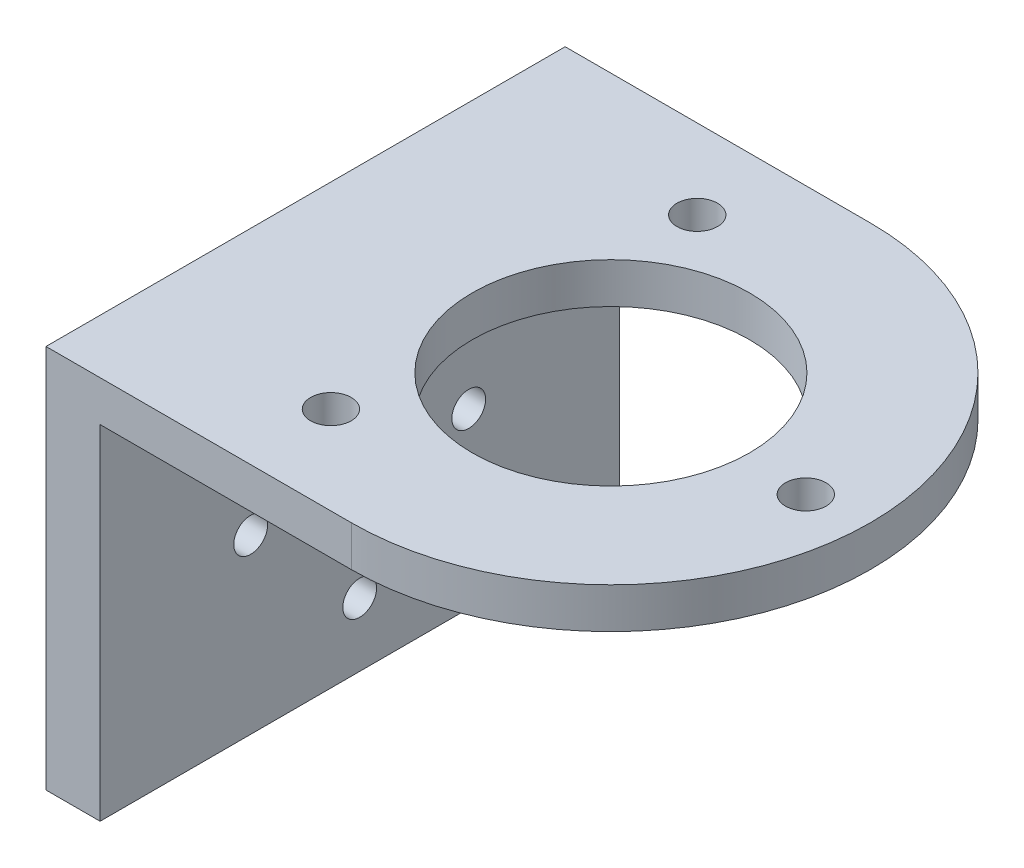
ISO-10303-21;
HEADER;
FILE_DESCRIPTION(('STEP AP214'),'2;1');
FILE_NAME('part.step','',(''),(''),'','','');
FILE_SCHEMA(('AUTOMOTIVE_DESIGN { 1 0 10303 214 1 1 1 1 }'));
ENDSEC;
DATA;
#1=APPLICATION_CONTEXT('core data for automotive mechanical design processes');
#2=APPLICATION_PROTOCOL_DEFINITION('international standard','automotive_design',2000,#1);
#3=PRODUCT_CONTEXT('',#1,'mechanical');
#4=PRODUCT('Part','Part','',(#3));
#5=PRODUCT_RELATED_PRODUCT_CATEGORY('part','',(#4));
#6=PRODUCT_DEFINITION_FORMATION('','',#4);
#7=PRODUCT_DEFINITION_CONTEXT('part definition',#1,'design');
#8=PRODUCT_DEFINITION('design','',#6,#7);
#9=PRODUCT_DEFINITION_SHAPE('','',#8);
#10=(LENGTH_UNIT() NAMED_UNIT(*) SI_UNIT(.MILLI.,.METRE.));
#11=(NAMED_UNIT(*) PLANE_ANGLE_UNIT() SI_UNIT($,.RADIAN.));
#12=(NAMED_UNIT(*) SI_UNIT($,.STERADIAN.) SOLID_ANGLE_UNIT());
#13=UNCERTAINTY_MEASURE_WITH_UNIT(LENGTH_MEASURE(1.E-05),#10,'distance_accuracy_value','');
#14=(GEOMETRIC_REPRESENTATION_CONTEXT(3) GLOBAL_UNCERTAINTY_ASSIGNED_CONTEXT((#13)) GLOBAL_UNIT_ASSIGNED_CONTEXT((#10,
#11,#12)) REPRESENTATION_CONTEXT('',''));
#15=CARTESIAN_POINT('',(0.,0.,0.));
#16=DIRECTION('',(0.,0.,1.));
#17=DIRECTION('',(1.,0.,0.));
#18=AXIS2_PLACEMENT_3D('',#15,#16,#17);
#19=CARTESIAN_POINT('',(0.,0.,0.));
#20=DIRECTION('',(0.,1.,0.));
#21=DIRECTION('',(0.,0.,1.));
#22=AXIS2_PLACEMENT_3D('',#19,#20,#21);
#23=PLANE('',#22);
#24=CARTESIAN_POINT('',(0.,0.,0.));
#25=DIRECTION('',(0.,1.,0.));
#26=DIRECTION('',(0.,0.,1.));
#27=AXIS2_PLACEMENT_3D('',#24,#25,#26);
#28=CIRCLE('',#27,10.25);
#29=CARTESIAN_POINT('',(0.,0.,10.25));
#30=VERTEX_POINT('',#29);
#31=EDGE_CURVE('E147',#30,#30,#28,.T.);
#32=ORIENTED_EDGE('',*,*,#31,.T.);
#33=EDGE_LOOP('',(#32));
#34=FACE_BOUND('',#33,.T.);
#35=CARTESIAN_POINT('',(14.988772763614,0.,0.580250842948611));
#36=DIRECTION('',(0.,1.,0.));
#37=DIRECTION('',(0.,0.,1.));
#38=AXIS2_PLACEMENT_3D('',#35,#36,#37);
#39=CIRCLE('',#38,1.49999999999998);
#40=CARTESIAN_POINT('',(14.988772763614,0.,2.08025084294859));
#41=VERTEX_POINT('',#40);
#42=EDGE_CURVE('E158',#41,#41,#39,.T.);
#43=ORIENTED_EDGE('',*,*,#42,.T.);
#44=EDGE_LOOP('',(#43));
#45=FACE_BOUND('',#44,.T.);
#46=CARTESIAN_POINT('',(-6.92362620941924,0.,-13.306517204447));
#47=DIRECTION('',(0.,1.,0.));
#48=DIRECTION('',(0.,0.,1.));
#49=AXIS2_PLACEMENT_3D('',#46,#47,#48);
#50=CIRCLE('',#49,1.5);
#51=CARTESIAN_POINT('',(-6.92362620941924,0.,-11.806517204447));
#52=VERTEX_POINT('',#51);
#53=EDGE_CURVE('E172',#52,#52,#50,.T.);
#54=ORIENTED_EDGE('',*,*,#53,.T.);
#55=EDGE_LOOP('',(#54));
#56=FACE_BOUND('',#55,.T.);
#57=CARTESIAN_POINT('',(-8.02946006501692,0.,12.6699554483944));
#58=DIRECTION('',(0.,1.,0.));
#59=DIRECTION('',(0.,0.,1.));
#60=AXIS2_PLACEMENT_3D('',#57,#58,#59);
#61=CIRCLE('',#60,1.5);
#62=CARTESIAN_POINT('',(-8.02946006501692,0.,14.1699554483944));
#63=VERTEX_POINT('',#62);
#64=EDGE_CURVE('E151',#63,#63,#61,.T.);
#65=ORIENTED_EDGE('',*,*,#64,.T.);
#66=EDGE_LOOP('',(#65));
#67=FACE_BOUND('',#66,.T.);
#68=DIRECTION('',(0.,0.,1.));
#69=VECTOR('',#68,1.);
#70=CARTESIAN_POINT('',(-18.5713262583329,0.,19.19));
#71=LINE('',#70,#69);
#72=CARTESIAN_POINT('',(-18.5713262583329,0.,-19.19));
#73=VERTEX_POINT('',#72);
#74=CARTESIAN_POINT('',(-18.5713262583329,0.,19.19));
#75=VERTEX_POINT('',#74);
#76=EDGE_CURVE('E69',#73,#75,#71,.T.);
#77=ORIENTED_EDGE('',*,*,#76,.F.);
#78=DIRECTION('',(-1.,0.,0.));
#79=VECTOR('',#78,1.);
#80=CARTESIAN_POINT('',(0.,0.,-19.19));
#81=LINE('',#80,#79);
#82=CARTESIAN_POINT('',(0.,0.,-19.19));
#83=VERTEX_POINT('',#82);
#84=EDGE_CURVE('E177',#83,#73,#81,.T.);
#85=ORIENTED_EDGE('',*,*,#84,.F.);
#86=CARTESIAN_POINT('',(0.,0.,0.));
#87=DIRECTION('',(0.,1.,0.));
#88=DIRECTION('',(0.,0.,1.));
#89=AXIS2_PLACEMENT_3D('',#86,#87,#88);
#90=CIRCLE('',#89,19.19);
#91=CARTESIAN_POINT('',(0.,0.,19.19));
#92=VERTEX_POINT('',#91);
#93=EDGE_CURVE('E175',#92,#83,#90,.T.);
#94=ORIENTED_EDGE('',*,*,#93,.F.);
#95=DIRECTION('',(-1.,0.,0.));
#96=VECTOR('',#95,1.);
#97=CARTESIAN_POINT('',(0.,0.,19.19));
#98=LINE('',#97,#96);
#99=EDGE_CURVE('E179',#92,#75,#98,.T.);
#100=ORIENTED_EDGE('',*,*,#99,.T.);
#101=EDGE_LOOP('',(#77,#85,#94,#100));
#102=FACE_BOUND('',#101,.T.);
#103=ADVANCED_FACE('F54',(#34,#45,#56,#67,#102),#23,.F.);
#104=CARTESIAN_POINT('',(0.,3.,0.));
#105=DIRECTION('',(0.,1.,0.));
#106=DIRECTION('',(0.,0.,1.));
#107=AXIS2_PLACEMENT_3D('',#104,#105,#106);
#108=PLANE('',#107);
#109=CARTESIAN_POINT('',(14.988772763614,3.,0.580250842948611));
#110=DIRECTION('',(0.,1.,0.));
#111=DIRECTION('',(0.,0.,1.));
#112=AXIS2_PLACEMENT_3D('',#109,#110,#111);
#113=CIRCLE('',#112,1.49999999999998);
#114=CARTESIAN_POINT('',(14.988772763614,3.,2.08025084294859));
#115=VERTEX_POINT('',#114);
#116=EDGE_CURVE('E167',#115,#115,#113,.T.);
#117=ORIENTED_EDGE('',*,*,#116,.F.);
#118=EDGE_LOOP('',(#117));
#119=FACE_BOUND('',#118,.T.);
#120=CARTESIAN_POINT('',(0.,3.,0.));
#121=DIRECTION('',(0.,1.,0.));
#122=DIRECTION('',(0.,0.,1.));
#123=AXIS2_PLACEMENT_3D('',#120,#121,#122);
#124=CIRCLE('',#123,19.19);
#125=CARTESIAN_POINT('',(0.,3.,19.19));
#126=VERTEX_POINT('',#125);
#127=CARTESIAN_POINT('',(0.,3.,-19.19));
#128=VERTEX_POINT('',#127);
#129=EDGE_CURVE('E161',#126,#128,#124,.T.);
#130=ORIENTED_EDGE('',*,*,#129,.T.);
#131=DIRECTION('',(-1.,0.,0.));
#132=VECTOR('',#131,1.);
#133=CARTESIAN_POINT('',(0.,3.,-19.19));
#134=LINE('',#133,#132);
#135=CARTESIAN_POINT('',(-22.5713262583329,3.,-19.19));
#136=VERTEX_POINT('',#135);
#137=EDGE_CURVE('E97',#128,#136,#134,.T.);
#138=ORIENTED_EDGE('',*,*,#137,.T.);
#139=DIRECTION('',(0.,0.,1.));
#140=VECTOR('',#139,1.);
#141=CARTESIAN_POINT('',(-22.5713262583329,3.,0.));
#142=LINE('',#141,#140);
#143=CARTESIAN_POINT('',(-22.5713262583329,3.,19.19));
#144=VERTEX_POINT('',#143);
#145=EDGE_CURVE('E120',#136,#144,#142,.T.);
#146=ORIENTED_EDGE('',*,*,#145,.T.);
#147=DIRECTION('',(-1.,0.,0.));
#148=VECTOR('',#147,1.);
#149=CARTESIAN_POINT('',(0.,3.,19.19));
#150=LINE('',#149,#148);
#151=EDGE_CURVE('E165',#126,#144,#150,.T.);
#152=ORIENTED_EDGE('',*,*,#151,.F.);
#153=EDGE_LOOP('',(#130,#138,#146,#152));
#154=FACE_BOUND('',#153,.T.);
#155=CARTESIAN_POINT('',(-6.92362620941924,3.,-13.306517204447));
#156=DIRECTION('',(0.,1.,0.));
#157=DIRECTION('',(0.,0.,1.));
#158=AXIS2_PLACEMENT_3D('',#155,#156,#157);
#159=CIRCLE('',#158,1.5);
#160=CARTESIAN_POINT('',(-6.92362620941924,3.,-11.806517204447));
#161=VERTEX_POINT('',#160);
#162=EDGE_CURVE('E157',#161,#161,#159,.T.);
#163=ORIENTED_EDGE('',*,*,#162,.F.);
#164=EDGE_LOOP('',(#163));
#165=FACE_BOUND('',#164,.T.);
#166=CARTESIAN_POINT('',(-8.02946006501692,3.,12.6699554483944));
#167=DIRECTION('',(0.,1.,0.));
#168=DIRECTION('',(0.,0.,1.));
#169=AXIS2_PLACEMENT_3D('',#166,#167,#168);
#170=CIRCLE('',#169,1.5);
#171=CARTESIAN_POINT('',(-8.02946006501692,3.,14.1699554483944));
#172=VERTEX_POINT('',#171);
#173=EDGE_CURVE('E154',#172,#172,#170,.T.);
#174=ORIENTED_EDGE('',*,*,#173,.F.);
#175=EDGE_LOOP('',(#174));
#176=FACE_BOUND('',#175,.T.);
#177=CARTESIAN_POINT('',(0.,3.,0.));
#178=DIRECTION('',(0.,1.,0.));
#179=DIRECTION('',(0.,0.,1.));
#180=AXIS2_PLACEMENT_3D('',#177,#178,#179);
#181=CIRCLE('',#180,10.25);
#182=CARTESIAN_POINT('',(0.,3.,10.25));
#183=VERTEX_POINT('',#182);
#184=EDGE_CURVE('E148',#183,#183,#181,.T.);
#185=ORIENTED_EDGE('',*,*,#184,.F.);
#186=EDGE_LOOP('',(#185));
#187=FACE_BOUND('',#186,.T.);
#188=ADVANCED_FACE('F187',(#119,#154,#165,#176,#187),#108,.T.);
#189=CARTESIAN_POINT('',(0.,3.,0.));
#190=DIRECTION('',(0.,-1.,0.));
#191=DIRECTION('',(0.,0.,-1.));
#192=AXIS2_PLACEMENT_3D('',#189,#190,#191);
#193=CYLINDRICAL_SURFACE('',#192,19.19);
#194=ORIENTED_EDGE('',*,*,#93,.T.);
#195=DIRECTION('',(0.,-1.,0.));
#196=VECTOR('',#195,1.);
#197=CARTESIAN_POINT('',(0.,3.,-19.19));
#198=LINE('',#197,#196);
#199=EDGE_CURVE('E12',#128,#83,#198,.T.);
#200=ORIENTED_EDGE('',*,*,#199,.F.);
#201=ORIENTED_EDGE('',*,*,#129,.F.);
#202=DIRECTION('',(0.,-1.,0.));
#203=VECTOR('',#202,1.);
#204=CARTESIAN_POINT('',(0.,3.,19.19));
#205=LINE('',#204,#203);
#206=EDGE_CURVE('E78',#126,#92,#205,.T.);
#207=ORIENTED_EDGE('',*,*,#206,.T.);
#208=EDGE_LOOP('',(#194,#200,#201,#207));
#209=FACE_BOUND('',#208,.T.);
#210=ADVANCED_FACE('F190',(#209),#193,.T.);
#211=CARTESIAN_POINT('',(0.,3.,-19.19));
#212=DIRECTION('',(0.,0.,1.));
#213=DIRECTION('',(1.,0.,0.));
#214=AXIS2_PLACEMENT_3D('',#211,#212,#213);
#215=PLANE('',#214);
#216=ORIENTED_EDGE('',*,*,#84,.T.);
#217=DIRECTION('',(0.,1.,0.));
#218=VECTOR('',#217,1.);
#219=CARTESIAN_POINT('',(-18.5713262583329,-25.4,-19.19));
#220=LINE('',#219,#218);
#221=CARTESIAN_POINT('',(-18.5713262583329,-25.4,-19.19));
#222=VERTEX_POINT('',#221);
#223=EDGE_CURVE('E126',#222,#73,#220,.T.);
#224=ORIENTED_EDGE('',*,*,#223,.F.);
#225=DIRECTION('',(1.,0.,0.));
#226=VECTOR('',#225,1.);
#227=CARTESIAN_POINT('',(-22.5713262583329,-25.4,-19.19));
#228=LINE('',#227,#226);
#229=CARTESIAN_POINT('',(-22.5713262583329,-25.4,-19.19));
#230=VERTEX_POINT('',#229);
#231=EDGE_CURVE('E123',#230,#222,#228,.T.);
#232=ORIENTED_EDGE('',*,*,#231,.F.);
#233=DIRECTION('',(0.,-1.,0.));
#234=VECTOR('',#233,1.);
#235=CARTESIAN_POINT('',(-22.5713262583329,3.,-19.19));
#236=LINE('',#235,#234);
#237=EDGE_CURVE('E62',#136,#230,#236,.T.);
#238=ORIENTED_EDGE('',*,*,#237,.F.);
#239=ORIENTED_EDGE('',*,*,#137,.F.);
#240=ORIENTED_EDGE('',*,*,#199,.T.);
#241=EDGE_LOOP('',(#216,#224,#232,#238,#239,#240));
#242=FACE_BOUND('',#241,.T.);
#243=ADVANCED_FACE('F124',(#242),#215,.F.);
#244=CARTESIAN_POINT('',(-22.5713262583329,3.,0.));
#245=DIRECTION('',(1.,0.,0.));
#246=DIRECTION('',(0.,0.,-1.));
#247=AXIS2_PLACEMENT_3D('',#244,#245,#246);
#248=PLANE('',#247);
#249=CARTESIAN_POINT('',(-22.5713262583329,-12.6235446928411,8.06));
#250=DIRECTION('',(1.,0.,0.));
#251=DIRECTION('',(0.,0.,-1.));
#252=AXIS2_PLACEMENT_3D('',#249,#250,#251);
#253=CIRCLE('',#252,1.25);
#254=CARTESIAN_POINT('',(-22.5713262583329,-12.6235446928411,6.81));
#255=VERTEX_POINT('',#254);
#256=EDGE_CURVE('E136',#255,#255,#253,.T.);
#257=ORIENTED_EDGE('',*,*,#256,.T.);
#258=EDGE_LOOP('',(#257));
#259=FACE_BOUND('',#258,.T.);
#260=CARTESIAN_POINT('',(-22.5713262583329,-20.6835446928411,0.));
#261=DIRECTION('',(1.,0.,0.));
#262=DIRECTION('',(0.,0.,-1.));
#263=AXIS2_PLACEMENT_3D('',#260,#261,#262);
#264=CIRCLE('',#263,1.25);
#265=CARTESIAN_POINT('',(-22.5713262583329,-20.6835446928411,-1.25));
#266=VERTEX_POINT('',#265);
#267=EDGE_CURVE('E271',#266,#266,#264,.T.);
#268=ORIENTED_EDGE('',*,*,#267,.T.);
#269=EDGE_LOOP('',(#268));
#270=FACE_BOUND('',#269,.T.);
#271=CARTESIAN_POINT('',(-22.5713262583329,-12.6235446928411,-8.06000000000001));
#272=DIRECTION('',(1.,0.,0.));
#273=DIRECTION('',(0.,0.,-1.));
#274=AXIS2_PLACEMENT_3D('',#271,#272,#273);
#275=CIRCLE('',#274,1.25);
#276=CARTESIAN_POINT('',(-22.5713262583329,-12.6235446928411,-9.31000000000001));
#277=VERTEX_POINT('',#276);
#278=EDGE_CURVE('E273',#277,#277,#275,.T.);
#279=ORIENTED_EDGE('',*,*,#278,.T.);
#280=EDGE_LOOP('',(#279));
#281=FACE_BOUND('',#280,.T.);
#282=CARTESIAN_POINT('',(-22.5713262583329,-4.56354469284111,0.));
#283=DIRECTION('',(1.,0.,0.));
#284=DIRECTION('',(0.,0.,-1.));
#285=AXIS2_PLACEMENT_3D('',#282,#283,#284);
#286=CIRCLE('',#285,1.25);
#287=CARTESIAN_POINT('',(-22.5713262583329,-4.56354469284111,-1.25));
#288=VERTEX_POINT('',#287);
#289=EDGE_CURVE('E277',#288,#288,#286,.T.);
#290=ORIENTED_EDGE('',*,*,#289,.T.);
#291=EDGE_LOOP('',(#290));
#292=FACE_BOUND('',#291,.T.);
#293=ORIENTED_EDGE('',*,*,#237,.T.);
#294=DIRECTION('',(0.,0.,-1.));
#295=VECTOR('',#294,1.);
#296=CARTESIAN_POINT('',(-22.5713262583329,-25.4,19.19));
#297=LINE('',#296,#295);
#298=CARTESIAN_POINT('',(-22.5713262583329,-25.4,19.19));
#299=VERTEX_POINT('',#298);
#300=EDGE_CURVE('E119',#299,#230,#297,.T.);
#301=ORIENTED_EDGE('',*,*,#300,.F.);
#302=DIRECTION('',(0.,-1.,0.));
#303=VECTOR('',#302,1.);
#304=CARTESIAN_POINT('',(-22.5713262583329,3.,19.19));
#305=LINE('',#304,#303);
#306=EDGE_CURVE('E121',#144,#299,#305,.T.);
#307=ORIENTED_EDGE('',*,*,#306,.F.);
#308=ORIENTED_EDGE('',*,*,#145,.F.);
#309=EDGE_LOOP('',(#293,#301,#307,#308));
#310=FACE_BOUND('',#309,.T.);
#311=ADVANCED_FACE('F116',(#259,#270,#281,#292,#310),#248,.F.);
#312=CARTESIAN_POINT('',(0.,3.,19.19));
#313=DIRECTION('',(0.,0.,1.));
#314=DIRECTION('',(1.,0.,0.));
#315=AXIS2_PLACEMENT_3D('',#312,#313,#314);
#316=PLANE('',#315);
#317=ORIENTED_EDGE('',*,*,#99,.F.);
#318=ORIENTED_EDGE('',*,*,#206,.F.);
#319=ORIENTED_EDGE('',*,*,#151,.T.);
#320=ORIENTED_EDGE('',*,*,#306,.T.);
#321=DIRECTION('',(-1.,0.,0.));
#322=VECTOR('',#321,1.);
#323=CARTESIAN_POINT('',(-22.5713262583329,-25.4,19.19));
#324=LINE('',#323,#322);
#325=CARTESIAN_POINT('',(-18.5713262583329,-25.4,19.19));
#326=VERTEX_POINT('',#325);
#327=EDGE_CURVE('E134',#326,#299,#324,.T.);
#328=ORIENTED_EDGE('',*,*,#327,.F.);
#329=DIRECTION('',(0.,1.,0.));
#330=VECTOR('',#329,1.);
#331=CARTESIAN_POINT('',(-18.5713262583329,-25.4,19.19));
#332=LINE('',#331,#330);
#333=EDGE_CURVE('E142',#326,#75,#332,.T.);
#334=ORIENTED_EDGE('',*,*,#333,.T.);
#335=EDGE_LOOP('',(#317,#318,#319,#320,#328,#334));
#336=FACE_BOUND('',#335,.T.);
#337=ADVANCED_FACE('F184',(#336),#316,.T.);
#338=CARTESIAN_POINT('',(-6.92362620941924,3.,-13.306517204447));
#339=DIRECTION('',(0.,-1.,0.));
#340=DIRECTION('',(0.,0.,-1.));
#341=AXIS2_PLACEMENT_3D('',#338,#339,#340);
#342=CYLINDRICAL_SURFACE('',#341,1.5);
#343=ORIENTED_EDGE('',*,*,#162,.T.);
#344=EDGE_LOOP('',(#343));
#345=FACE_BOUND('',#344,.T.);
#346=ORIENTED_EDGE('',*,*,#53,.F.);
#347=EDGE_LOOP('',(#346));
#348=FACE_BOUND('',#347,.T.);
#349=ADVANCED_FACE('F212',(#345,#348),#342,.F.);
#350=CARTESIAN_POINT('',(-8.02946006501692,3.,12.6699554483944));
#351=DIRECTION('',(0.,-1.,0.));
#352=DIRECTION('',(0.,0.,-1.));
#353=AXIS2_PLACEMENT_3D('',#350,#351,#352);
#354=CYLINDRICAL_SURFACE('',#353,1.5);
#355=ORIENTED_EDGE('',*,*,#173,.T.);
#356=EDGE_LOOP('',(#355));
#357=FACE_BOUND('',#356,.T.);
#358=ORIENTED_EDGE('',*,*,#64,.F.);
#359=EDGE_LOOP('',(#358));
#360=FACE_BOUND('',#359,.T.);
#361=ADVANCED_FACE('F56',(#357,#360),#354,.F.);
#362=CARTESIAN_POINT('',(14.988772763614,3.,0.580250842948611));
#363=DIRECTION('',(0.,-1.,0.));
#364=DIRECTION('',(0.,0.,-1.));
#365=AXIS2_PLACEMENT_3D('',#362,#363,#364);
#366=CYLINDRICAL_SURFACE('',#365,1.49999999999998);
#367=ORIENTED_EDGE('',*,*,#116,.T.);
#368=EDGE_LOOP('',(#367));
#369=FACE_BOUND('',#368,.T.);
#370=ORIENTED_EDGE('',*,*,#42,.F.);
#371=EDGE_LOOP('',(#370));
#372=FACE_BOUND('',#371,.T.);
#373=ADVANCED_FACE('F205',(#369,#372),#366,.F.);
#374=CARTESIAN_POINT('',(0.,3.,0.));
#375=DIRECTION('',(0.,-1.,0.));
#376=DIRECTION('',(0.,0.,-1.));
#377=AXIS2_PLACEMENT_3D('',#374,#375,#376);
#378=CYLINDRICAL_SURFACE('',#377,10.25);
#379=ORIENTED_EDGE('',*,*,#184,.T.);
#380=EDGE_LOOP('',(#379));
#381=FACE_BOUND('',#380,.T.);
#382=ORIENTED_EDGE('',*,*,#31,.F.);
#383=EDGE_LOOP('',(#382));
#384=FACE_BOUND('',#383,.T.);
#385=ADVANCED_FACE('F208',(#381,#384),#378,.F.);
#386=CARTESIAN_POINT('',(-18.5713262583329,-25.4,19.19));
#387=DIRECTION('',(-1.,0.,0.));
#388=DIRECTION('',(0.,0.,1.));
#389=AXIS2_PLACEMENT_3D('',#386,#387,#388);
#390=PLANE('',#389);
#391=CARTESIAN_POINT('',(-18.5713262583329,-12.6235446928411,8.06));
#392=DIRECTION('',(1.,0.,0.));
#393=DIRECTION('',(0.,0.,-1.));
#394=AXIS2_PLACEMENT_3D('',#391,#392,#393);
#395=CIRCLE('',#394,1.25);
#396=CARTESIAN_POINT('',(-18.5713262583329,-12.6235446928411,6.81));
#397=VERTEX_POINT('',#396);
#398=EDGE_CURVE('E268',#397,#397,#395,.T.);
#399=ORIENTED_EDGE('',*,*,#398,.F.);
#400=EDGE_LOOP('',(#399));
#401=FACE_BOUND('',#400,.T.);
#402=CARTESIAN_POINT('',(-18.5713262583329,-20.6835446928411,0.));
#403=DIRECTION('',(1.,0.,0.));
#404=DIRECTION('',(0.,0.,-1.));
#405=AXIS2_PLACEMENT_3D('',#402,#403,#404);
#406=CIRCLE('',#405,1.25);
#407=CARTESIAN_POINT('',(-18.5713262583329,-20.6835446928411,-1.25));
#408=VERTEX_POINT('',#407);
#409=EDGE_CURVE('E288',#408,#408,#406,.T.);
#410=ORIENTED_EDGE('',*,*,#409,.F.);
#411=EDGE_LOOP('',(#410));
#412=FACE_BOUND('',#411,.T.);
#413=CARTESIAN_POINT('',(-18.5713262583329,-12.6235446928411,-8.06));
#414=DIRECTION('',(1.,0.,0.));
#415=DIRECTION('',(0.,0.,-1.));
#416=AXIS2_PLACEMENT_3D('',#413,#414,#415);
#417=CIRCLE('',#416,1.25);
#418=CARTESIAN_POINT('',(-18.5713262583329,-12.6235446928411,-9.31));
#419=VERTEX_POINT('',#418);
#420=EDGE_CURVE('E285',#419,#419,#417,.T.);
#421=ORIENTED_EDGE('',*,*,#420,.F.);
#422=EDGE_LOOP('',(#421));
#423=FACE_BOUND('',#422,.T.);
#424=CARTESIAN_POINT('',(-18.5713262583329,-4.56354469284111,0.));
#425=DIRECTION('',(1.,0.,0.));
#426=DIRECTION('',(0.,0.,-1.));
#427=AXIS2_PLACEMENT_3D('',#424,#425,#426);
#428=CIRCLE('',#427,1.25);
#429=CARTESIAN_POINT('',(-18.5713262583329,-4.56354469284111,-1.25));
#430=VERTEX_POINT('',#429);
#431=EDGE_CURVE('E282',#430,#430,#428,.T.);
#432=ORIENTED_EDGE('',*,*,#431,.F.);
#433=EDGE_LOOP('',(#432));
#434=FACE_BOUND('',#433,.T.);
#435=ORIENTED_EDGE('',*,*,#76,.T.);
#436=ORIENTED_EDGE('',*,*,#333,.F.);
#437=DIRECTION('',(0.,0.,1.));
#438=VECTOR('',#437,1.);
#439=CARTESIAN_POINT('',(-18.5713262583329,-25.4,19.19));
#440=LINE('',#439,#438);
#441=EDGE_CURVE('E129',#222,#326,#440,.T.);
#442=ORIENTED_EDGE('',*,*,#441,.F.);
#443=ORIENTED_EDGE('',*,*,#223,.T.);
#444=EDGE_LOOP('',(#435,#436,#442,#443));
#445=FACE_BOUND('',#444,.T.);
#446=ADVANCED_FACE('F192',(#401,#412,#423,#434,#445),#390,.F.);
#447=CARTESIAN_POINT('',(0.,-25.4,0.));
#448=DIRECTION('',(0.,-1.,0.));
#449=DIRECTION('',(0.,0.,-1.));
#450=AXIS2_PLACEMENT_3D('',#447,#448,#449);
#451=PLANE('',#450);
#452=ORIENTED_EDGE('',*,*,#300,.T.);
#453=ORIENTED_EDGE('',*,*,#231,.T.);
#454=ORIENTED_EDGE('',*,*,#441,.T.);
#455=ORIENTED_EDGE('',*,*,#327,.T.);
#456=EDGE_LOOP('',(#452,#453,#454,#455));
#457=FACE_BOUND('',#456,.T.);
#458=ADVANCED_FACE('F132',(#457),#451,.T.);
#459=CARTESIAN_POINT('',(-43.9713262583329,-4.56354469284111,0.));
#460=DIRECTION('',(1.,0.,0.));
#461=DIRECTION('',(0.,0.,-1.));
#462=AXIS2_PLACEMENT_3D('',#459,#460,#461);
#463=CYLINDRICAL_SURFACE('',#462,1.25);
#464=ORIENTED_EDGE('',*,*,#431,.T.);
#465=EDGE_LOOP('',(#464));
#466=FACE_BOUND('',#465,.T.);
#467=ORIENTED_EDGE('',*,*,#289,.F.);
#468=EDGE_LOOP('',(#467));
#469=FACE_BOUND('',#468,.T.);
#470=ADVANCED_FACE('F248',(#466,#469),#463,.F.);
#471=CARTESIAN_POINT('',(-43.9713262583329,-12.6235446928411,-8.06000000000001));
#472=DIRECTION('',(1.,0.,0.));
#473=DIRECTION('',(0.,0.,-1.));
#474=AXIS2_PLACEMENT_3D('',#471,#472,#473);
#475=CYLINDRICAL_SURFACE('',#474,1.25);
#476=ORIENTED_EDGE('',*,*,#420,.T.);
#477=EDGE_LOOP('',(#476));
#478=FACE_BOUND('',#477,.T.);
#479=ORIENTED_EDGE('',*,*,#278,.F.);
#480=EDGE_LOOP('',(#479));
#481=FACE_BOUND('',#480,.T.);
#482=ADVANCED_FACE('F251',(#478,#481),#475,.F.);
#483=CARTESIAN_POINT('',(-43.9713262583329,-20.6835446928411,0.));
#484=DIRECTION('',(1.,0.,0.));
#485=DIRECTION('',(0.,0.,-1.));
#486=AXIS2_PLACEMENT_3D('',#483,#484,#485);
#487=CYLINDRICAL_SURFACE('',#486,1.25);
#488=ORIENTED_EDGE('',*,*,#409,.T.);
#489=EDGE_LOOP('',(#488));
#490=FACE_BOUND('',#489,.T.);
#491=ORIENTED_EDGE('',*,*,#267,.F.);
#492=EDGE_LOOP('',(#491));
#493=FACE_BOUND('',#492,.T.);
#494=ADVANCED_FACE('F255',(#490,#493),#487,.F.);
#495=CARTESIAN_POINT('',(-43.9713262583329,-12.6235446928411,8.05999999999999));
#496=DIRECTION('',(1.,0.,0.));
#497=DIRECTION('',(0.,0.,-1.));
#498=AXIS2_PLACEMENT_3D('',#495,#496,#497);
#499=CYLINDRICAL_SURFACE('',#498,1.25);
#500=ORIENTED_EDGE('',*,*,#398,.T.);
#501=EDGE_LOOP('',(#500));
#502=FACE_BOUND('',#501,.T.);
#503=ORIENTED_EDGE('',*,*,#256,.F.);
#504=EDGE_LOOP('',(#503));
#505=FACE_BOUND('',#504,.T.);
#506=ADVANCED_FACE('F259',(#502,#505),#499,.F.);
#507=CLOSED_SHELL('',(#103,#188,#210,#243,#311,#337,#349,#361,#373,#385,#446,#458,#470,#482,
#494,#506));
#508=MANIFOLD_SOLID_BREP('B2',#507);
#509=ADVANCED_BREP_SHAPE_REPRESENTATION('',(#18,#508),#14);
#510=SHAPE_DEFINITION_REPRESENTATION(#9,#509);
ENDSEC;
END-ISO-10303-21;
